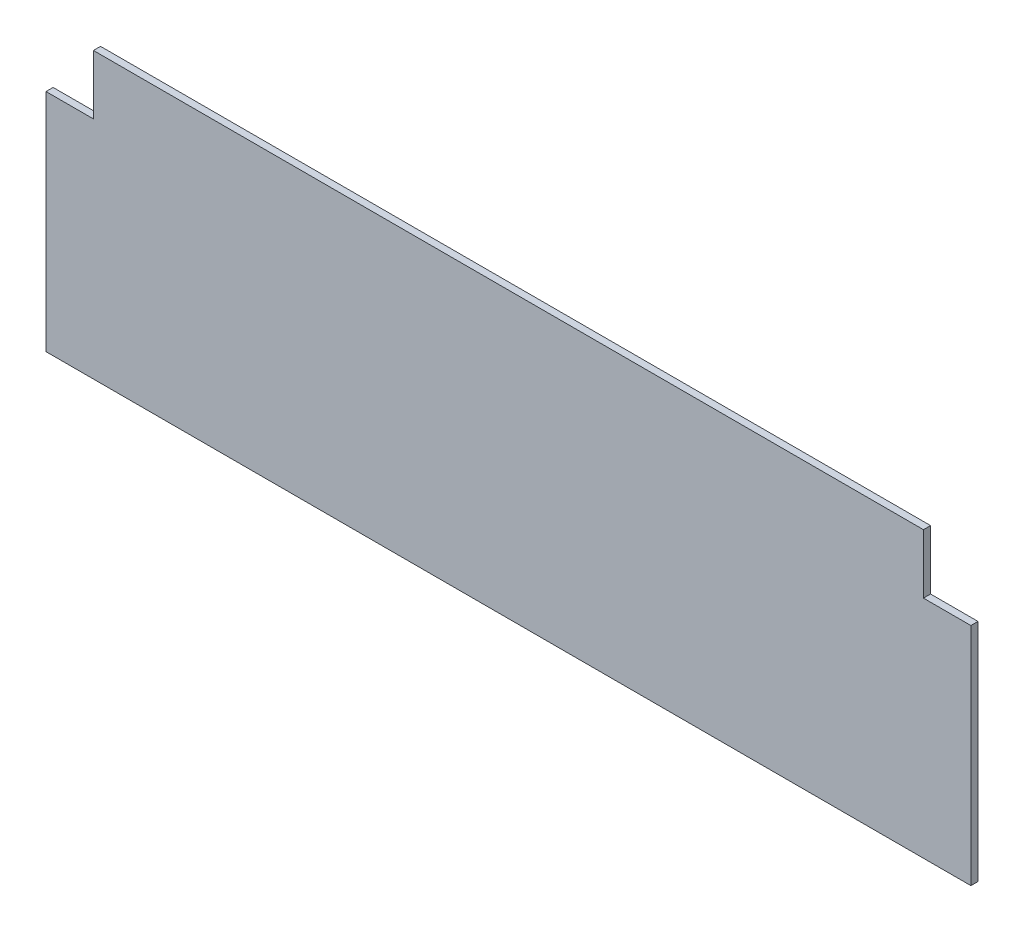
ISO-10303-21;
HEADER;
FILE_DESCRIPTION(('STEP AP214'),'2;1');
FILE_NAME('part.step','',(''),(''),'','','');
FILE_SCHEMA(('AUTOMOTIVE_DESIGN { 1 0 10303 214 1 1 1 1 }'));
ENDSEC;
DATA;
#1=APPLICATION_CONTEXT('core data for automotive mechanical design processes');
#2=APPLICATION_PROTOCOL_DEFINITION('international standard','automotive_design',2000,#1);
#3=PRODUCT_CONTEXT('',#1,'mechanical');
#4=PRODUCT('Part','Part','',(#3));
#5=PRODUCT_RELATED_PRODUCT_CATEGORY('part','',(#4));
#6=PRODUCT_DEFINITION_FORMATION('','',#4);
#7=PRODUCT_DEFINITION_CONTEXT('part definition',#1,'design');
#8=PRODUCT_DEFINITION('design','',#6,#7);
#9=PRODUCT_DEFINITION_SHAPE('','',#8);
#10=(LENGTH_UNIT() NAMED_UNIT(*) SI_UNIT(.MILLI.,.METRE.));
#11=(NAMED_UNIT(*) PLANE_ANGLE_UNIT() SI_UNIT($,.RADIAN.));
#12=(NAMED_UNIT(*) SI_UNIT($,.STERADIAN.) SOLID_ANGLE_UNIT());
#13=UNCERTAINTY_MEASURE_WITH_UNIT(LENGTH_MEASURE(1.E-05),#10,'distance_accuracy_value','');
#14=(GEOMETRIC_REPRESENTATION_CONTEXT(3) GLOBAL_UNCERTAINTY_ASSIGNED_CONTEXT((#13)) GLOBAL_UNIT_ASSIGNED_CONTEXT((#10,
#11,#12)) REPRESENTATION_CONTEXT('',''));
#15=CARTESIAN_POINT('',(0.,0.,0.));
#16=DIRECTION('',(0.,0.,1.));
#17=DIRECTION('',(1.,0.,0.));
#18=AXIS2_PLACEMENT_3D('',#15,#16,#17);
#19=CARTESIAN_POINT('',(390.,-20.,3.));
#20=DIRECTION('',(-1.,0.,0.));
#21=DIRECTION('',(0.,0.,1.));
#22=AXIS2_PLACEMENT_3D('',#19,#20,#21);
#23=PLANE('',#22);
#24=DIRECTION('',(0.,1.,0.));
#25=VECTOR('',#24,1.);
#26=CARTESIAN_POINT('',(390.,-20.,0.));
#27=LINE('',#26,#25);
#28=CARTESIAN_POINT('',(390.,-115.,0.));
#29=VERTEX_POINT('',#28);
#30=CARTESIAN_POINT('',(390.,-20.,0.));
#31=VERTEX_POINT('',#30);
#32=EDGE_CURVE('E131',#29,#31,#27,.T.);
#33=ORIENTED_EDGE('',*,*,#32,.T.);
#34=DIRECTION('',(0.,0.,-1.));
#35=VECTOR('',#34,1.);
#36=CARTESIAN_POINT('',(390.,-20.,3.));
#37=LINE('',#36,#35);
#38=CARTESIAN_POINT('',(390.,-20.,3.));
#39=VERTEX_POINT('',#38);
#40=EDGE_CURVE('E11',#39,#31,#37,.T.);
#41=ORIENTED_EDGE('',*,*,#40,.F.);
#42=DIRECTION('',(0.,1.,0.));
#43=VECTOR('',#42,1.);
#44=CARTESIAN_POINT('',(390.,-20.,3.));
#45=LINE('',#44,#43);
#46=CARTESIAN_POINT('',(390.,-115.,3.));
#47=VERTEX_POINT('',#46);
#48=EDGE_CURVE('E145',#47,#39,#45,.T.);
#49=ORIENTED_EDGE('',*,*,#48,.F.);
#50=DIRECTION('',(0.,0.,-1.));
#51=VECTOR('',#50,1.);
#52=CARTESIAN_POINT('',(390.,-115.,3.));
#53=LINE('',#52,#51);
#54=EDGE_CURVE('E127',#47,#29,#53,.T.);
#55=ORIENTED_EDGE('',*,*,#54,.T.);
#56=EDGE_LOOP('',(#33,#41,#49,#55));
#57=FACE_BOUND('',#56,.T.);
#58=ADVANCED_FACE('F35',(#57),#23,.F.);
#59=CARTESIAN_POINT('',(390.,-20.,3.));
#60=DIRECTION('',(0.,-1.,0.));
#61=DIRECTION('',(1.,0.,0.));
#62=AXIS2_PLACEMENT_3D('',#59,#60,#61);
#63=PLANE('',#62);
#64=DIRECTION('',(-1.,0.,0.));
#65=VECTOR('',#64,1.);
#66=CARTESIAN_POINT('',(390.,-20.,0.));
#67=LINE('',#66,#65);
#68=CARTESIAN_POINT('',(370.,-20.,0.));
#69=VERTEX_POINT('',#68);
#70=EDGE_CURVE('E134',#31,#69,#67,.T.);
#71=ORIENTED_EDGE('',*,*,#70,.T.);
#72=DIRECTION('',(0.,0.,-1.));
#73=VECTOR('',#72,1.);
#74=CARTESIAN_POINT('',(370.,-20.,3.));
#75=LINE('',#74,#73);
#76=CARTESIAN_POINT('',(370.,-20.,3.));
#77=VERTEX_POINT('',#76);
#78=EDGE_CURVE('E43',#77,#69,#75,.T.);
#79=ORIENTED_EDGE('',*,*,#78,.F.);
#80=DIRECTION('',(-1.,0.,0.));
#81=VECTOR('',#80,1.);
#82=CARTESIAN_POINT('',(390.,-20.,3.));
#83=LINE('',#82,#81);
#84=EDGE_CURVE('E94',#39,#77,#83,.T.);
#85=ORIENTED_EDGE('',*,*,#84,.F.);
#86=ORIENTED_EDGE('',*,*,#40,.T.);
#87=EDGE_LOOP('',(#71,#79,#85,#86));
#88=FACE_BOUND('',#87,.T.);
#89=ADVANCED_FACE('F180',(#88),#63,.F.);
#90=CARTESIAN_POINT('',(370.,5.,3.));
#91=DIRECTION('',(-1.,0.,0.));
#92=DIRECTION('',(0.,0.,1.));
#93=AXIS2_PLACEMENT_3D('',#90,#91,#92);
#94=PLANE('',#93);
#95=DIRECTION('',(0.,1.,0.));
#96=VECTOR('',#95,1.);
#97=CARTESIAN_POINT('',(370.,5.,0.));
#98=LINE('',#97,#96);
#99=CARTESIAN_POINT('',(370.,5.,0.));
#100=VERTEX_POINT('',#99);
#101=EDGE_CURVE('E136',#69,#100,#98,.T.);
#102=ORIENTED_EDGE('',*,*,#101,.T.);
#103=DIRECTION('',(0.,0.,-1.));
#104=VECTOR('',#103,1.);
#105=CARTESIAN_POINT('',(370.,5.,3.));
#106=LINE('',#105,#104);
#107=CARTESIAN_POINT('',(370.,5.,3.));
#108=VERTEX_POINT('',#107);
#109=EDGE_CURVE('E152',#108,#100,#106,.T.);
#110=ORIENTED_EDGE('',*,*,#109,.F.);
#111=DIRECTION('',(0.,1.,0.));
#112=VECTOR('',#111,1.);
#113=CARTESIAN_POINT('',(370.,5.,3.));
#114=LINE('',#113,#112);
#115=EDGE_CURVE('E160',#77,#108,#114,.T.);
#116=ORIENTED_EDGE('',*,*,#115,.F.);
#117=ORIENTED_EDGE('',*,*,#78,.T.);
#118=EDGE_LOOP('',(#102,#110,#116,#117));
#119=FACE_BOUND('',#118,.T.);
#120=ADVANCED_FACE('F158',(#119),#94,.F.);
#121=CARTESIAN_POINT('',(20.,5.,3.));
#122=DIRECTION('',(0.,-1.,0.));
#123=DIRECTION('',(0.,0.,-1.));
#124=AXIS2_PLACEMENT_3D('',#121,#122,#123);
#125=PLANE('',#124);
#126=DIRECTION('',(-1.,0.,0.));
#127=VECTOR('',#126,1.);
#128=CARTESIAN_POINT('',(20.,5.,0.));
#129=LINE('',#128,#127);
#130=CARTESIAN_POINT('',(20.,5.,0.));
#131=VERTEX_POINT('',#130);
#132=EDGE_CURVE('E138',#100,#131,#129,.T.);
#133=ORIENTED_EDGE('',*,*,#132,.T.);
#134=DIRECTION('',(0.,0.,-1.));
#135=VECTOR('',#134,1.);
#136=CARTESIAN_POINT('',(20.,5.,3.));
#137=LINE('',#136,#135);
#138=CARTESIAN_POINT('',(20.,5.,3.));
#139=VERTEX_POINT('',#138);
#140=EDGE_CURVE('E149',#139,#131,#137,.T.);
#141=ORIENTED_EDGE('',*,*,#140,.F.);
#142=DIRECTION('',(-1.,0.,0.));
#143=VECTOR('',#142,1.);
#144=CARTESIAN_POINT('',(20.,5.,3.));
#145=LINE('',#144,#143);
#146=EDGE_CURVE('E172',#108,#139,#145,.T.);
#147=ORIENTED_EDGE('',*,*,#146,.F.);
#148=ORIENTED_EDGE('',*,*,#109,.T.);
#149=EDGE_LOOP('',(#133,#141,#147,#148));
#150=FACE_BOUND('',#149,.T.);
#151=ADVANCED_FACE('F168',(#150),#125,.F.);
#152=CARTESIAN_POINT('',(20.,5.,3.));
#153=DIRECTION('',(1.,0.,0.));
#154=DIRECTION('',(0.,1.,0.));
#155=AXIS2_PLACEMENT_3D('',#152,#153,#154);
#156=PLANE('',#155);
#157=DIRECTION('',(0.,-1.,0.));
#158=VECTOR('',#157,1.);
#159=CARTESIAN_POINT('',(20.,5.,0.));
#160=LINE('',#159,#158);
#161=CARTESIAN_POINT('',(20.,-20.,0.));
#162=VERTEX_POINT('',#161);
#163=EDGE_CURVE('E140',#131,#162,#160,.T.);
#164=ORIENTED_EDGE('',*,*,#163,.T.);
#165=DIRECTION('',(0.,0.,-1.));
#166=VECTOR('',#165,1.);
#167=CARTESIAN_POINT('',(20.,-20.,3.));
#168=LINE('',#167,#166);
#169=CARTESIAN_POINT('',(20.,-20.,3.));
#170=VERTEX_POINT('',#169);
#171=EDGE_CURVE('E122',#170,#162,#168,.T.);
#172=ORIENTED_EDGE('',*,*,#171,.F.);
#173=DIRECTION('',(0.,-1.,0.));
#174=VECTOR('',#173,1.);
#175=CARTESIAN_POINT('',(20.,5.,3.));
#176=LINE('',#175,#174);
#177=EDGE_CURVE('E113',#139,#170,#176,.T.);
#178=ORIENTED_EDGE('',*,*,#177,.F.);
#179=ORIENTED_EDGE('',*,*,#140,.T.);
#180=EDGE_LOOP('',(#164,#172,#178,#179));
#181=FACE_BOUND('',#180,.T.);
#182=ADVANCED_FACE('F171',(#181),#156,.F.);
#183=CARTESIAN_POINT('',(0.,-20.,3.));
#184=DIRECTION('',(0.,-1.,0.));
#185=DIRECTION('',(0.,0.,-1.));
#186=AXIS2_PLACEMENT_3D('',#183,#184,#185);
#187=PLANE('',#186);
#188=DIRECTION('',(-1.,0.,0.));
#189=VECTOR('',#188,1.);
#190=CARTESIAN_POINT('',(0.,-20.,0.));
#191=LINE('',#190,#189);
#192=CARTESIAN_POINT('',(0.,-20.,0.));
#193=VERTEX_POINT('',#192);
#194=EDGE_CURVE('E121',#162,#193,#191,.T.);
#195=ORIENTED_EDGE('',*,*,#194,.T.);
#196=DIRECTION('',(0.,0.,-1.));
#197=VECTOR('',#196,1.);
#198=CARTESIAN_POINT('',(0.,-20.,3.));
#199=LINE('',#198,#197);
#200=CARTESIAN_POINT('',(0.,-20.,3.));
#201=VERTEX_POINT('',#200);
#202=EDGE_CURVE('E118',#201,#193,#199,.T.);
#203=ORIENTED_EDGE('',*,*,#202,.F.);
#204=DIRECTION('',(-1.,0.,0.));
#205=VECTOR('',#204,1.);
#206=CARTESIAN_POINT('',(0.,-20.,3.));
#207=LINE('',#206,#205);
#208=EDGE_CURVE('E107',#170,#201,#207,.T.);
#209=ORIENTED_EDGE('',*,*,#208,.F.);
#210=ORIENTED_EDGE('',*,*,#171,.T.);
#211=EDGE_LOOP('',(#195,#203,#209,#210));
#212=FACE_BOUND('',#211,.T.);
#213=ADVANCED_FACE('F119',(#212),#187,.F.);
#214=CARTESIAN_POINT('',(0.,-20.,3.));
#215=DIRECTION('',(1.,0.,0.));
#216=DIRECTION('',(0.,1.,0.));
#217=AXIS2_PLACEMENT_3D('',#214,#215,#216);
#218=PLANE('',#217);
#219=DIRECTION('',(0.,-1.,0.));
#220=VECTOR('',#219,1.);
#221=CARTESIAN_POINT('',(0.,-20.,0.));
#222=LINE('',#221,#220);
#223=CARTESIAN_POINT('',(0.,-115.,0.));
#224=VERTEX_POINT('',#223);
#225=EDGE_CURVE('E80',#193,#224,#222,.T.);
#226=ORIENTED_EDGE('',*,*,#225,.T.);
#227=DIRECTION('',(0.,0.,-1.));
#228=VECTOR('',#227,1.);
#229=CARTESIAN_POINT('',(0.,-115.,3.));
#230=LINE('',#229,#228);
#231=CARTESIAN_POINT('',(0.,-115.,3.));
#232=VERTEX_POINT('',#231);
#233=EDGE_CURVE('E123',#232,#224,#230,.T.);
#234=ORIENTED_EDGE('',*,*,#233,.F.);
#235=DIRECTION('',(0.,-1.,0.));
#236=VECTOR('',#235,1.);
#237=CARTESIAN_POINT('',(0.,-20.,3.));
#238=LINE('',#237,#236);
#239=EDGE_CURVE('E111',#201,#232,#238,.T.);
#240=ORIENTED_EDGE('',*,*,#239,.F.);
#241=ORIENTED_EDGE('',*,*,#202,.T.);
#242=EDGE_LOOP('',(#226,#234,#240,#241));
#243=FACE_BOUND('',#242,.T.);
#244=ADVANCED_FACE('F125',(#243),#218,.F.);
#245=CARTESIAN_POINT('',(0.,-115.,3.));
#246=DIRECTION('',(0.,1.,0.));
#247=DIRECTION('',(0.,0.,1.));
#248=AXIS2_PLACEMENT_3D('',#245,#246,#247);
#249=PLANE('',#248);
#250=DIRECTION('',(1.,0.,0.));
#251=VECTOR('',#250,1.);
#252=CARTESIAN_POINT('',(0.,-115.,0.));
#253=LINE('',#252,#251);
#254=EDGE_CURVE('E86',#224,#29,#253,.T.);
#255=ORIENTED_EDGE('',*,*,#254,.T.);
#256=ORIENTED_EDGE('',*,*,#54,.F.);
#257=DIRECTION('',(1.,0.,0.));
#258=VECTOR('',#257,1.);
#259=CARTESIAN_POINT('',(0.,-115.,3.));
#260=LINE('',#259,#258);
#261=EDGE_CURVE('E51',#232,#47,#260,.T.);
#262=ORIENTED_EDGE('',*,*,#261,.F.);
#263=ORIENTED_EDGE('',*,*,#233,.T.);
#264=EDGE_LOOP('',(#255,#256,#262,#263));
#265=FACE_BOUND('',#264,.T.);
#266=ADVANCED_FACE('F196',(#265),#249,.F.);
#267=CARTESIAN_POINT('',(0.,0.,3.));
#268=DIRECTION('',(0.,0.,1.));
#269=DIRECTION('',(1.,0.,0.));
#270=AXIS2_PLACEMENT_3D('',#267,#268,#269);
#271=PLANE('',#270);
#272=ORIENTED_EDGE('',*,*,#48,.T.);
#273=ORIENTED_EDGE('',*,*,#84,.T.);
#274=ORIENTED_EDGE('',*,*,#115,.T.);
#275=ORIENTED_EDGE('',*,*,#146,.T.);
#276=ORIENTED_EDGE('',*,*,#177,.T.);
#277=ORIENTED_EDGE('',*,*,#208,.T.);
#278=ORIENTED_EDGE('',*,*,#239,.T.);
#279=ORIENTED_EDGE('',*,*,#261,.T.);
#280=EDGE_LOOP('',(#272,#273,#274,#275,#276,#277,#278,#279));
#281=FACE_BOUND('',#280,.T.);
#282=ADVANCED_FACE('F109',(#281),#271,.T.);
#283=CARTESIAN_POINT('',(0.,0.,0.));
#284=DIRECTION('',(0.,0.,1.));
#285=DIRECTION('',(1.,0.,0.));
#286=AXIS2_PLACEMENT_3D('',#283,#284,#285);
#287=PLANE('',#286);
#288=ORIENTED_EDGE('',*,*,#32,.F.);
#289=ORIENTED_EDGE('',*,*,#254,.F.);
#290=ORIENTED_EDGE('',*,*,#225,.F.);
#291=ORIENTED_EDGE('',*,*,#194,.F.);
#292=ORIENTED_EDGE('',*,*,#163,.F.);
#293=ORIENTED_EDGE('',*,*,#132,.F.);
#294=ORIENTED_EDGE('',*,*,#101,.F.);
#295=ORIENTED_EDGE('',*,*,#70,.F.);
#296=EDGE_LOOP('',(#288,#289,#290,#291,#292,#293,#294,#295));
#297=FACE_BOUND('',#296,.T.);
#298=ADVANCED_FACE('F164',(#297),#287,.F.);
#299=CLOSED_SHELL('',(#58,#89,#120,#151,#182,#213,#244,#266,#282,#298));
#300=MANIFOLD_SOLID_BREP('B2',#299);
#301=ADVANCED_BREP_SHAPE_REPRESENTATION('',(#18,#300),#14);
#302=SHAPE_DEFINITION_REPRESENTATION(#9,#301);
ENDSEC;
END-ISO-10303-21;
